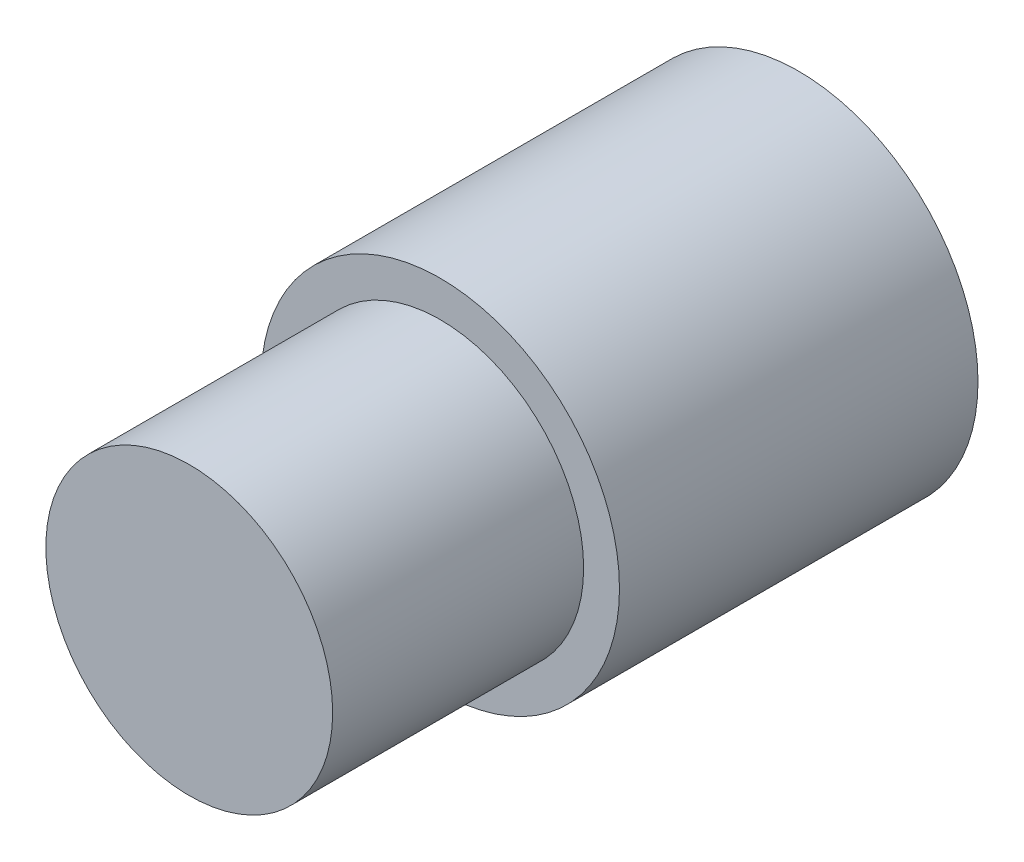
ISO-10303-21;
HEADER;
FILE_DESCRIPTION(('STEP AP214'),'2;1');
FILE_NAME('part.step','',(''),(''),'','','');
FILE_SCHEMA(('AUTOMOTIVE_DESIGN { 1 0 10303 214 1 1 1 1 }'));
ENDSEC;
DATA;
#1=APPLICATION_CONTEXT('core data for automotive mechanical design processes');
#2=APPLICATION_PROTOCOL_DEFINITION('international standard','automotive_design',2000,#1);
#3=PRODUCT_CONTEXT('',#1,'mechanical');
#4=PRODUCT('Part','Part','',(#3));
#5=PRODUCT_RELATED_PRODUCT_CATEGORY('part','',(#4));
#6=PRODUCT_DEFINITION_FORMATION('','',#4);
#7=PRODUCT_DEFINITION_CONTEXT('part definition',#1,'design');
#8=PRODUCT_DEFINITION('design','',#6,#7);
#9=PRODUCT_DEFINITION_SHAPE('','',#8);
#10=(LENGTH_UNIT() NAMED_UNIT(*) SI_UNIT(.MILLI.,.METRE.));
#11=(NAMED_UNIT(*) PLANE_ANGLE_UNIT() SI_UNIT($,.RADIAN.));
#12=(NAMED_UNIT(*) SI_UNIT($,.STERADIAN.) SOLID_ANGLE_UNIT());
#13=UNCERTAINTY_MEASURE_WITH_UNIT(LENGTH_MEASURE(1.E-05),#10,'distance_accuracy_value','');
#14=(GEOMETRIC_REPRESENTATION_CONTEXT(3) GLOBAL_UNCERTAINTY_ASSIGNED_CONTEXT((#13)) GLOBAL_UNIT_ASSIGNED_CONTEXT((#10,
#11,#12)) REPRESENTATION_CONTEXT('',''));
#15=CARTESIAN_POINT('',(0.,0.,0.));
#16=DIRECTION('',(0.,0.,1.));
#17=DIRECTION('',(1.,0.,0.));
#18=AXIS2_PLACEMENT_3D('',#15,#16,#17);
#19=CARTESIAN_POINT('',(0.,0.,10.));
#20=DIRECTION('',(0.,0.,1.));
#21=DIRECTION('',(1.,0.,0.));
#22=AXIS2_PLACEMENT_3D('',#19,#20,#21);
#23=PLANE('',#22);
#24=CARTESIAN_POINT('',(0.,0.,10.));
#25=DIRECTION('',(0.,0.,1.));
#26=DIRECTION('',(1.,0.,0.));
#27=AXIS2_PLACEMENT_3D('',#24,#25,#26);
#28=CIRCLE('',#27,4.);
#29=CARTESIAN_POINT('',(4.,0.,10.));
#30=VERTEX_POINT('',#29);
#31=EDGE_CURVE('E10',#30,#30,#28,.T.);
#32=ORIENTED_EDGE('',*,*,#31,.F.);
#33=EDGE_LOOP('',(#32));
#34=FACE_BOUND('',#33,.T.);
#35=CARTESIAN_POINT('',(0.,0.,10.));
#36=DIRECTION('',(0.,0.,1.));
#37=DIRECTION('',(1.,0.,0.));
#38=AXIS2_PLACEMENT_3D('',#35,#36,#37);
#39=CIRCLE('',#38,5.);
#40=CARTESIAN_POINT('',(5.,0.,10.));
#41=VERTEX_POINT('',#40);
#42=EDGE_CURVE('E50',#41,#41,#39,.T.);
#43=ORIENTED_EDGE('',*,*,#42,.T.);
#44=EDGE_LOOP('',(#43));
#45=FACE_BOUND('',#44,.T.);
#46=ADVANCED_FACE('F41',(#34,#45),#23,.T.);
#47=CARTESIAN_POINT('',(0.,0.,0.));
#48=DIRECTION('',(0.,0.,1.));
#49=DIRECTION('',(1.,0.,0.));
#50=AXIS2_PLACEMENT_3D('',#47,#48,#49);
#51=PLANE('',#50);
#52=CARTESIAN_POINT('',(0.,0.,0.));
#53=DIRECTION('',(0.,0.,1.));
#54=DIRECTION('',(1.,0.,0.));
#55=AXIS2_PLACEMENT_3D('',#52,#53,#54);
#56=CIRCLE('',#55,5.);
#57=CARTESIAN_POINT('',(5.,0.,0.));
#58=VERTEX_POINT('',#57);
#59=EDGE_CURVE('E45',#58,#58,#56,.T.);
#60=ORIENTED_EDGE('',*,*,#59,.F.);
#61=EDGE_LOOP('',(#60));
#62=FACE_BOUND('',#61,.T.);
#63=CARTESIAN_POINT('',(0.,0.,0.));
#64=DIRECTION('',(0.,0.,1.));
#65=DIRECTION('',(1.,0.,0.));
#66=AXIS2_PLACEMENT_3D('',#63,#64,#65);
#67=CIRCLE('',#66,1.5);
#68=CARTESIAN_POINT('',(1.5,0.,0.));
#69=VERTEX_POINT('',#68);
#70=EDGE_CURVE('E63',#69,#69,#67,.T.);
#71=ORIENTED_EDGE('',*,*,#70,.T.);
#72=EDGE_LOOP('',(#71));
#73=FACE_BOUND('',#72,.T.);
#74=ADVANCED_FACE('F73',(#62,#73),#51,.F.);
#75=CARTESIAN_POINT('',(0.,0.,10.));
#76=DIRECTION('',(0.,0.,-1.));
#77=DIRECTION('',(-1.,0.,0.));
#78=AXIS2_PLACEMENT_3D('',#75,#76,#77);
#79=CYLINDRICAL_SURFACE('',#78,5.);
#80=ORIENTED_EDGE('',*,*,#42,.F.);
#81=EDGE_LOOP('',(#80));
#82=FACE_BOUND('',#81,.T.);
#83=ORIENTED_EDGE('',*,*,#59,.T.);
#84=EDGE_LOOP('',(#83));
#85=FACE_BOUND('',#84,.T.);
#86=ADVANCED_FACE('F43',(#82,#85),#79,.T.);
#87=CARTESIAN_POINT('',(0.,0.,10.));
#88=DIRECTION('',(0.,0.,-1.));
#89=DIRECTION('',(-1.,0.,0.));
#90=AXIS2_PLACEMENT_3D('',#87,#88,#89);
#91=CYLINDRICAL_SURFACE('',#90,1.5);
#92=CARTESIAN_POINT('',(0.,0.,10.));
#93=DIRECTION('',(0.,0.,1.));
#94=DIRECTION('',(1.,0.,0.));
#95=AXIS2_PLACEMENT_3D('',#92,#93,#94);
#96=CIRCLE('',#95,1.5);
#97=CARTESIAN_POINT('',(1.5,0.,10.));
#98=VERTEX_POINT('',#97);
#99=EDGE_CURVE('E59',#98,#98,#96,.T.);
#100=ORIENTED_EDGE('',*,*,#99,.T.);
#101=EDGE_LOOP('',(#100));
#102=FACE_BOUND('',#101,.T.);
#103=ORIENTED_EDGE('',*,*,#70,.F.);
#104=EDGE_LOOP('',(#103));
#105=FACE_BOUND('',#104,.T.);
#106=ADVANCED_FACE('F79',(#102,#105),#91,.F.);
#107=CARTESIAN_POINT('',(0.,0.,17.));
#108=DIRECTION('',(0.,0.,1.));
#109=DIRECTION('',(1.,0.,0.));
#110=AXIS2_PLACEMENT_3D('',#107,#108,#109);
#111=PLANE('',#110);
#112=CARTESIAN_POINT('',(0.,0.,17.));
#113=DIRECTION('',(0.,0.,1.));
#114=DIRECTION('',(1.,0.,0.));
#115=AXIS2_PLACEMENT_3D('',#112,#113,#114);
#116=CIRCLE('',#115,4.);
#117=CARTESIAN_POINT('',(4.,0.,17.));
#118=VERTEX_POINT('',#117);
#119=EDGE_CURVE('E58',#118,#118,#116,.T.);
#120=ORIENTED_EDGE('',*,*,#119,.T.);
#121=EDGE_LOOP('',(#120));
#122=FACE_BOUND('',#121,.T.);
#123=ADVANCED_FACE('F86',(#122),#111,.T.);
#124=CARTESIAN_POINT('',(0.,0.,17.));
#125=DIRECTION('',(0.,0.,-1.));
#126=DIRECTION('',(-1.,0.,0.));
#127=AXIS2_PLACEMENT_3D('',#124,#125,#126);
#128=CYLINDRICAL_SURFACE('',#127,4.);
#129=ORIENTED_EDGE('',*,*,#119,.F.);
#130=EDGE_LOOP('',(#129));
#131=FACE_BOUND('',#130,.T.);
#132=ORIENTED_EDGE('',*,*,#31,.T.);
#133=EDGE_LOOP('',(#132));
#134=FACE_BOUND('',#133,.T.);
#135=ADVANCED_FACE('F88',(#131,#134),#128,.T.);
#136=CARTESIAN_POINT('',(0.,0.,10.));
#137=DIRECTION('',(0.,0.,1.));
#138=DIRECTION('',(1.,0.,0.));
#139=AXIS2_PLACEMENT_3D('',#136,#137,#138);
#140=PLANE('',#139);
#141=ORIENTED_EDGE('',*,*,#99,.F.);
#142=EDGE_LOOP('',(#141));
#143=FACE_BOUND('',#142,.T.);
#144=ADVANCED_FACE('F91',(#143),#140,.F.);
#145=CLOSED_SHELL('',(#46,#74,#86,#106,#123,#135,#144));
#146=MANIFOLD_SOLID_BREP('B2',#145);
#147=ADVANCED_BREP_SHAPE_REPRESENTATION('',(#18,#146),#14);
#148=SHAPE_DEFINITION_REPRESENTATION(#9,#147);
ENDSEC;
END-ISO-10303-21;
